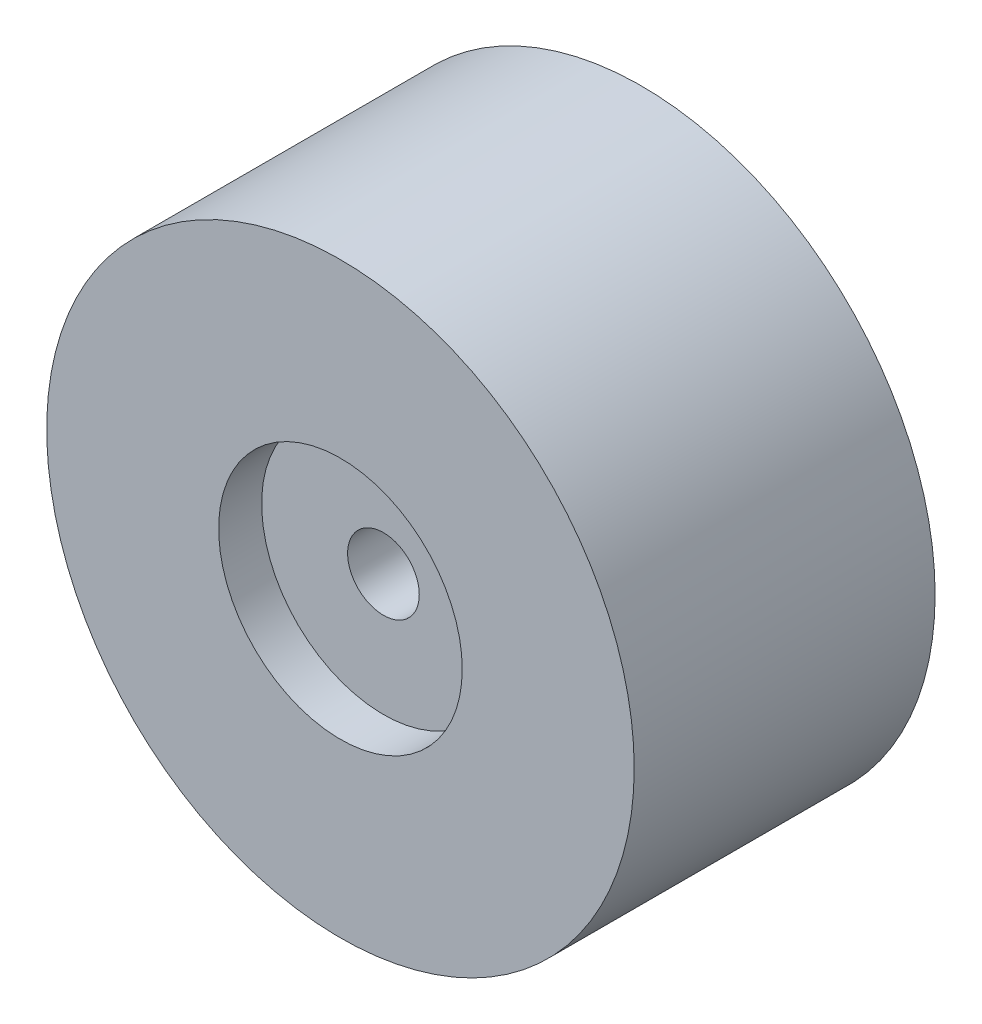
ISO-10303-21;
HEADER;
FILE_DESCRIPTION(('STEP AP214'),'2;1');
FILE_NAME('part.step','',(''),(''),'','','');
FILE_SCHEMA(('AUTOMOTIVE_DESIGN { 1 0 10303 214 1 1 1 1 }'));
ENDSEC;
DATA;
#1=APPLICATION_CONTEXT('core data for automotive mechanical design processes');
#2=APPLICATION_PROTOCOL_DEFINITION('international standard','automotive_design',2000,#1);
#3=PRODUCT_CONTEXT('',#1,'mechanical');
#4=PRODUCT('Part','Part','',(#3));
#5=PRODUCT_RELATED_PRODUCT_CATEGORY('part','',(#4));
#6=PRODUCT_DEFINITION_FORMATION('','',#4);
#7=PRODUCT_DEFINITION_CONTEXT('part definition',#1,'design');
#8=PRODUCT_DEFINITION('design','',#6,#7);
#9=PRODUCT_DEFINITION_SHAPE('','',#8);
#10=(LENGTH_UNIT() NAMED_UNIT(*) SI_UNIT(.MILLI.,.METRE.));
#11=(NAMED_UNIT(*) PLANE_ANGLE_UNIT() SI_UNIT($,.RADIAN.));
#12=(NAMED_UNIT(*) SI_UNIT($,.STERADIAN.) SOLID_ANGLE_UNIT());
#13=UNCERTAINTY_MEASURE_WITH_UNIT(LENGTH_MEASURE(1.E-05),#10,'distance_accuracy_value','');
#14=(GEOMETRIC_REPRESENTATION_CONTEXT(3) GLOBAL_UNCERTAINTY_ASSIGNED_CONTEXT((#13)) GLOBAL_UNIT_ASSIGNED_CONTEXT((#10,
#11,#12)) REPRESENTATION_CONTEXT('',''));
#15=CARTESIAN_POINT('',(0.,0.,0.));
#16=DIRECTION('',(0.,0.,1.));
#17=DIRECTION('',(1.,0.,0.));
#18=AXIS2_PLACEMENT_3D('',#15,#16,#17);
#19=CARTESIAN_POINT('',(0.,0.,9.));
#20=DIRECTION('',(0.,0.,1.));
#21=DIRECTION('',(1.,0.,0.));
#22=AXIS2_PLACEMENT_3D('',#19,#20,#21);
#23=PLANE('',#22);
#24=CARTESIAN_POINT('',(0.,0.,9.));
#25=DIRECTION('',(0.,0.,1.));
#26=DIRECTION('',(1.,0.,0.));
#27=AXIS2_PLACEMENT_3D('',#24,#25,#26);
#28=CIRCLE('',#27,1.25);
#29=CARTESIAN_POINT('',(1.25,0.,9.));
#30=VERTEX_POINT('',#29);
#31=EDGE_CURVE('E41',#30,#30,#28,.T.);
#32=ORIENTED_EDGE('',*,*,#31,.F.);
#33=EDGE_LOOP('',(#32));
#34=FACE_BOUND('',#33,.T.);
#35=CARTESIAN_POINT('',(0.,0.,9.));
#36=DIRECTION('',(0.,0.,1.));
#37=DIRECTION('',(1.,0.,0.));
#38=AXIS2_PLACEMENT_3D('',#35,#36,#37);
#39=CIRCLE('',#38,4.25);
#40=CARTESIAN_POINT('',(4.25,0.,9.));
#41=VERTEX_POINT('',#40);
#42=EDGE_CURVE('E10',#41,#41,#39,.F.);
#43=ORIENTED_EDGE('',*,*,#42,.F.);
#44=EDGE_LOOP('',(#43));
#45=FACE_BOUND('',#44,.T.);
#46=ADVANCED_FACE('F30',(#34,#45),#23,.T.);
#47=CARTESIAN_POINT('',(0.,0.,0.));
#48=DIRECTION('',(0.,0.,1.));
#49=DIRECTION('',(1.,0.,0.));
#50=AXIS2_PLACEMENT_3D('',#47,#48,#49);
#51=PLANE('',#50);
#52=CARTESIAN_POINT('',(0.,0.,0.));
#53=DIRECTION('',(0.,0.,1.));
#54=DIRECTION('',(1.,0.,0.));
#55=AXIS2_PLACEMENT_3D('',#52,#53,#54);
#56=CIRCLE('',#55,10.25);
#57=CARTESIAN_POINT('',(10.25,0.,0.));
#58=VERTEX_POINT('',#57);
#59=EDGE_CURVE('E37',#58,#58,#56,.T.);
#60=ORIENTED_EDGE('',*,*,#59,.F.);
#61=EDGE_LOOP('',(#60));
#62=FACE_BOUND('',#61,.T.);
#63=CARTESIAN_POINT('',(0.,0.,0.));
#64=DIRECTION('',(0.,0.,1.));
#65=DIRECTION('',(1.,0.,0.));
#66=AXIS2_PLACEMENT_3D('',#63,#64,#65);
#67=CIRCLE('',#66,1.25);
#68=CARTESIAN_POINT('',(1.25,0.,0.));
#69=VERTEX_POINT('',#68);
#70=EDGE_CURVE('E45',#69,#69,#67,.T.);
#71=ORIENTED_EDGE('',*,*,#70,.T.);
#72=EDGE_LOOP('',(#71));
#73=FACE_BOUND('',#72,.T.);
#74=ADVANCED_FACE('F72',(#62,#73),#51,.F.);
#75=CARTESIAN_POINT('',(0.,0.,9.));
#76=DIRECTION('',(0.,0.,-1.));
#77=DIRECTION('',(-1.,0.,0.));
#78=AXIS2_PLACEMENT_3D('',#75,#76,#77);
#79=CYLINDRICAL_SURFACE('',#78,10.25);
#80=ORIENTED_EDGE('',*,*,#59,.T.);
#81=EDGE_LOOP('',(#80));
#82=FACE_BOUND('',#81,.T.);
#83=CARTESIAN_POINT('',(0.,0.,10.5));
#84=DIRECTION('',(0.,0.,1.));
#85=DIRECTION('',(1.,0.,0.));
#86=AXIS2_PLACEMENT_3D('',#83,#84,#85);
#87=CIRCLE('',#86,10.25);
#88=CARTESIAN_POINT('',(10.25,0.,10.5));
#89=VERTEX_POINT('',#88);
#90=EDGE_CURVE('E49',#89,#89,#87,.T.);
#91=ORIENTED_EDGE('',*,*,#90,.F.);
#92=EDGE_LOOP('',(#91));
#93=FACE_BOUND('',#92,.T.);
#94=ADVANCED_FACE('F32',(#82,#93),#79,.T.);
#95=CARTESIAN_POINT('',(0.,0.,9.));
#96=DIRECTION('',(0.,0.,-1.));
#97=DIRECTION('',(-1.,0.,0.));
#98=AXIS2_PLACEMENT_3D('',#95,#96,#97);
#99=CYLINDRICAL_SURFACE('',#98,1.25);
#100=ORIENTED_EDGE('',*,*,#31,.T.);
#101=EDGE_LOOP('',(#100));
#102=FACE_BOUND('',#101,.T.);
#103=ORIENTED_EDGE('',*,*,#70,.F.);
#104=EDGE_LOOP('',(#103));
#105=FACE_BOUND('',#104,.T.);
#106=ADVANCED_FACE('F61',(#102,#105),#99,.F.);
#107=CARTESIAN_POINT('',(0.,0.,10.5));
#108=DIRECTION('',(0.,0.,1.));
#109=DIRECTION('',(1.,0.,0.));
#110=AXIS2_PLACEMENT_3D('',#107,#108,#109);
#111=PLANE('',#110);
#112=ORIENTED_EDGE('',*,*,#90,.T.);
#113=EDGE_LOOP('',(#112));
#114=FACE_BOUND('',#113,.T.);
#115=CARTESIAN_POINT('',(0.,0.,10.5));
#116=DIRECTION('',(0.,0.,1.));
#117=DIRECTION('',(1.,0.,0.));
#118=AXIS2_PLACEMENT_3D('',#115,#116,#117);
#119=CIRCLE('',#118,4.25);
#120=CARTESIAN_POINT('',(4.25,0.,10.5));
#121=VERTEX_POINT('',#120);
#122=EDGE_CURVE('E53',#121,#121,#119,.T.);
#123=ORIENTED_EDGE('',*,*,#122,.F.);
#124=EDGE_LOOP('',(#123));
#125=FACE_BOUND('',#124,.T.);
#126=ADVANCED_FACE('F59',(#114,#125),#111,.T.);
#127=CARTESIAN_POINT('',(0.,0.,10.5));
#128=DIRECTION('',(0.,0.,-1.));
#129=DIRECTION('',(-1.,0.,0.));
#130=AXIS2_PLACEMENT_3D('',#127,#128,#129);
#131=CYLINDRICAL_SURFACE('',#130,4.25);
#132=ORIENTED_EDGE('',*,*,#122,.T.);
#133=EDGE_LOOP('',(#132));
#134=FACE_BOUND('',#133,.T.);
#135=ORIENTED_EDGE('',*,*,#42,.T.);
#136=EDGE_LOOP('',(#135));
#137=FACE_BOUND('',#136,.T.);
#138=ADVANCED_FACE('F57',(#134,#137),#131,.F.);
#139=CLOSED_SHELL('',(#46,#74,#94,#106,#126,#138));
#140=MANIFOLD_SOLID_BREP('B2',#139);
#141=ADVANCED_BREP_SHAPE_REPRESENTATION('',(#18,#140),#14);
#142=SHAPE_DEFINITION_REPRESENTATION(#9,#141);
ENDSEC;
END-ISO-10303-21;
